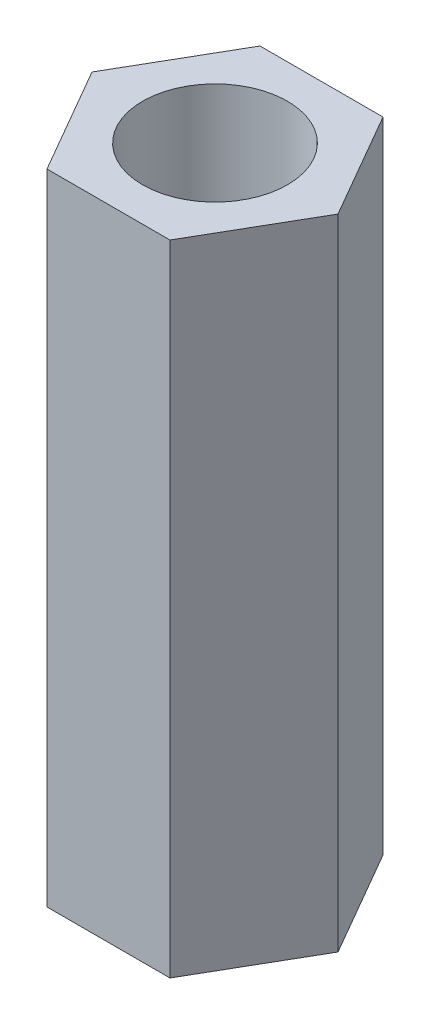
ISO-10303-21;
HEADER;
FILE_DESCRIPTION(('STEP AP214'),'2;1');
FILE_NAME('part.step','',(''),(''),'','','');
FILE_SCHEMA(('AUTOMOTIVE_DESIGN { 1 0 10303 214 1 1 1 1 }'));
ENDSEC;
DATA;
#1=APPLICATION_CONTEXT('core data for automotive mechanical design processes');
#2=APPLICATION_PROTOCOL_DEFINITION('international standard','automotive_design',2000,#1);
#3=PRODUCT_CONTEXT('',#1,'mechanical');
#4=PRODUCT('Part','Part','',(#3));
#5=PRODUCT_RELATED_PRODUCT_CATEGORY('part','',(#4));
#6=PRODUCT_DEFINITION_FORMATION('','',#4);
#7=PRODUCT_DEFINITION_CONTEXT('part definition',#1,'design');
#8=PRODUCT_DEFINITION('design','',#6,#7);
#9=PRODUCT_DEFINITION_SHAPE('','',#8);
#10=(LENGTH_UNIT() NAMED_UNIT(*) SI_UNIT(.MILLI.,.METRE.));
#11=(NAMED_UNIT(*) PLANE_ANGLE_UNIT() SI_UNIT($,.RADIAN.));
#12=(NAMED_UNIT(*) SI_UNIT($,.STERADIAN.) SOLID_ANGLE_UNIT());
#13=UNCERTAINTY_MEASURE_WITH_UNIT(LENGTH_MEASURE(1.E-05),#10,'distance_accuracy_value','');
#14=(GEOMETRIC_REPRESENTATION_CONTEXT(3) GLOBAL_UNCERTAINTY_ASSIGNED_CONTEXT((#13)) GLOBAL_UNIT_ASSIGNED_CONTEXT((#10,
#11,#12)) REPRESENTATION_CONTEXT('',''));
#15=CARTESIAN_POINT('',(0.,0.,0.));
#16=DIRECTION('',(0.,0.,1.));
#17=DIRECTION('',(1.,0.,0.));
#18=AXIS2_PLACEMENT_3D('',#15,#16,#17);
#19=CARTESIAN_POINT('',(0.,15.,0.));
#20=DIRECTION('',(0.,1.,0.));
#21=DIRECTION('',(0.,0.,1.));
#22=AXIS2_PLACEMENT_3D('',#19,#20,#21);
#23=PLANE('',#22);
#24=DIRECTION('',(0.5,0.,-0.866025403784439));
#25=VECTOR('',#24,1.);
#26=CARTESIAN_POINT('',(1.44337567297407,15.,2.5));
#27=LINE('',#26,#25);
#28=CARTESIAN_POINT('',(1.44337567297407,15.,2.5));
#29=VERTEX_POINT('',#28);
#30=CARTESIAN_POINT('',(2.88675134594813,15.,0.));
#31=VERTEX_POINT('',#30);
#32=EDGE_CURVE('E129',#29,#31,#27,.T.);
#33=ORIENTED_EDGE('',*,*,#32,.T.);
#34=DIRECTION('',(-0.5,0.,-0.866025403784438));
#35=VECTOR('',#34,1.);
#36=CARTESIAN_POINT('',(2.88675134594813,15.,0.));
#37=LINE('',#36,#35);
#38=CARTESIAN_POINT('',(1.44337567297406,15.,-2.5));
#39=VERTEX_POINT('',#38);
#40=EDGE_CURVE('E87',#31,#39,#37,.T.);
#41=ORIENTED_EDGE('',*,*,#40,.T.);
#42=DIRECTION('',(-1.,0.,0.));
#43=VECTOR('',#42,1.);
#44=CARTESIAN_POINT('',(1.44337567297406,15.,-2.5));
#45=LINE('',#44,#43);
#46=CARTESIAN_POINT('',(-1.44337567297406,15.,-2.5));
#47=VERTEX_POINT('',#46);
#48=EDGE_CURVE('E100',#39,#47,#45,.T.);
#49=ORIENTED_EDGE('',*,*,#48,.T.);
#50=DIRECTION('',(-0.5,0.,0.866025403784439));
#51=VECTOR('',#50,1.);
#52=CARTESIAN_POINT('',(-1.44337567297406,15.,-2.5));
#53=LINE('',#52,#51);
#54=CARTESIAN_POINT('',(-2.88675134594813,15.,0.));
#55=VERTEX_POINT('',#54);
#56=EDGE_CURVE('E94',#47,#55,#53,.T.);
#57=ORIENTED_EDGE('',*,*,#56,.T.);
#58=DIRECTION('',(0.5,0.,0.866025403784438));
#59=VECTOR('',#58,1.);
#60=CARTESIAN_POINT('',(-2.88675134594813,15.,0.));
#61=LINE('',#60,#59);
#62=CARTESIAN_POINT('',(-1.44337567297406,15.,2.5));
#63=VERTEX_POINT('',#62);
#64=EDGE_CURVE('E98',#55,#63,#61,.T.);
#65=ORIENTED_EDGE('',*,*,#64,.T.);
#66=DIRECTION('',(1.,0.,0.));
#67=VECTOR('',#66,1.);
#68=CARTESIAN_POINT('',(-1.44337567297406,15.,2.5));
#69=LINE('',#68,#67);
#70=EDGE_CURVE('E50',#63,#29,#69,.T.);
#71=ORIENTED_EDGE('',*,*,#70,.T.);
#72=EDGE_LOOP('',(#33,#41,#49,#57,#65,#71));
#73=FACE_BOUND('',#72,.T.);
#74=CARTESIAN_POINT('',(0.,15.,0.));
#75=DIRECTION('',(0.,1.,0.));
#76=DIRECTION('',(0.,0.,1.));
#77=AXIS2_PLACEMENT_3D('',#74,#75,#76);
#78=CIRCLE('',#77,1.7);
#79=CARTESIAN_POINT('',(0.,15.,1.7));
#80=VERTEX_POINT('',#79);
#81=EDGE_CURVE('E122',#80,#80,#78,.T.);
#82=ORIENTED_EDGE('',*,*,#81,.F.);
#83=EDGE_LOOP('',(#82));
#84=FACE_BOUND('',#83,.T.);
#85=ADVANCED_FACE('F33',(#73,#84),#23,.T.);
#86=CARTESIAN_POINT('',(0.,0.,0.));
#87=DIRECTION('',(0.,1.,0.));
#88=DIRECTION('',(0.,0.,1.));
#89=AXIS2_PLACEMENT_3D('',#86,#87,#88);
#90=PLANE('',#89);
#91=DIRECTION('',(0.5,0.,-0.866025403784439));
#92=VECTOR('',#91,1.);
#93=CARTESIAN_POINT('',(1.44337567297407,0.,2.5));
#94=LINE('',#93,#92);
#95=CARTESIAN_POINT('',(1.44337567297407,0.,2.5));
#96=VERTEX_POINT('',#95);
#97=CARTESIAN_POINT('',(2.88675134594813,0.,0.));
#98=VERTEX_POINT('',#97);
#99=EDGE_CURVE('E118',#96,#98,#94,.T.);
#100=ORIENTED_EDGE('',*,*,#99,.F.);
#101=DIRECTION('',(1.,0.,0.));
#102=VECTOR('',#101,1.);
#103=CARTESIAN_POINT('',(-1.44337567297406,0.,2.5));
#104=LINE('',#103,#102);
#105=CARTESIAN_POINT('',(-1.44337567297406,0.,2.5));
#106=VERTEX_POINT('',#105);
#107=EDGE_CURVE('E79',#106,#96,#104,.T.);
#108=ORIENTED_EDGE('',*,*,#107,.F.);
#109=DIRECTION('',(0.5,0.,0.866025403784438));
#110=VECTOR('',#109,1.);
#111=CARTESIAN_POINT('',(-2.88675134594813,0.,0.));
#112=LINE('',#111,#110);
#113=CARTESIAN_POINT('',(-2.88675134594813,0.,0.));
#114=VERTEX_POINT('',#113);
#115=EDGE_CURVE('E73',#114,#106,#112,.T.);
#116=ORIENTED_EDGE('',*,*,#115,.F.);
#117=DIRECTION('',(-0.5,0.,0.866025403784439));
#118=VECTOR('',#117,1.);
#119=CARTESIAN_POINT('',(-1.44337567297406,0.,-2.5));
#120=LINE('',#119,#118);
#121=CARTESIAN_POINT('',(-1.44337567297406,0.,-2.5));
#122=VERTEX_POINT('',#121);
#123=EDGE_CURVE('E108',#122,#114,#120,.T.);
#124=ORIENTED_EDGE('',*,*,#123,.F.);
#125=DIRECTION('',(-1.,0.,0.));
#126=VECTOR('',#125,1.);
#127=CARTESIAN_POINT('',(1.44337567297406,0.,-2.5));
#128=LINE('',#127,#126);
#129=CARTESIAN_POINT('',(1.44337567297406,0.,-2.5));
#130=VERTEX_POINT('',#129);
#131=EDGE_CURVE('E124',#130,#122,#128,.T.);
#132=ORIENTED_EDGE('',*,*,#131,.F.);
#133=DIRECTION('',(-0.5,0.,-0.866025403784438));
#134=VECTOR('',#133,1.);
#135=CARTESIAN_POINT('',(2.88675134594813,0.,0.));
#136=LINE('',#135,#134);
#137=EDGE_CURVE('E121',#98,#130,#136,.T.);
#138=ORIENTED_EDGE('',*,*,#137,.F.);
#139=EDGE_LOOP('',(#100,#108,#116,#124,#132,#138));
#140=FACE_BOUND('',#139,.T.);
#141=CARTESIAN_POINT('',(0.,0.,0.));
#142=DIRECTION('',(0.,1.,0.));
#143=DIRECTION('',(0.,0.,1.));
#144=AXIS2_PLACEMENT_3D('',#141,#142,#143);
#145=CIRCLE('',#144,1.7);
#146=CARTESIAN_POINT('',(0.,0.,1.7));
#147=VERTEX_POINT('',#146);
#148=EDGE_CURVE('E222',#147,#147,#145,.T.);
#149=ORIENTED_EDGE('',*,*,#148,.T.);
#150=EDGE_LOOP('',(#149));
#151=FACE_BOUND('',#150,.T.);
#152=ADVANCED_FACE('F138',(#140,#151),#90,.F.);
#153=CARTESIAN_POINT('',(1.44337567297407,15.,2.5));
#154=DIRECTION('',(-0.866025403784439,0.,-0.5));
#155=DIRECTION('',(-0.5,0.,0.866025403784439));
#156=AXIS2_PLACEMENT_3D('',#153,#154,#155);
#157=PLANE('',#156);
#158=ORIENTED_EDGE('',*,*,#99,.T.);
#159=DIRECTION('',(0.,-1.,0.));
#160=VECTOR('',#159,1.);
#161=CARTESIAN_POINT('',(2.88675134594813,15.,0.));
#162=LINE('',#161,#160);
#163=EDGE_CURVE('E11',#31,#98,#162,.T.);
#164=ORIENTED_EDGE('',*,*,#163,.F.);
#165=ORIENTED_EDGE('',*,*,#32,.F.);
#166=DIRECTION('',(0.,-1.,0.));
#167=VECTOR('',#166,1.);
#168=CARTESIAN_POINT('',(1.44337567297407,15.,2.5));
#169=LINE('',#168,#167);
#170=EDGE_CURVE('E114',#29,#96,#169,.T.);
#171=ORIENTED_EDGE('',*,*,#170,.T.);
#172=EDGE_LOOP('',(#158,#164,#165,#171));
#173=FACE_BOUND('',#172,.T.);
#174=ADVANCED_FACE('F35',(#173),#157,.F.);
#175=CARTESIAN_POINT('',(2.88675134594813,15.,0.));
#176=DIRECTION('',(-0.866025403784438,0.,0.5));
#177=DIRECTION('',(0.5,0.,0.866025403784439));
#178=AXIS2_PLACEMENT_3D('',#175,#176,#177);
#179=PLANE('',#178);
#180=ORIENTED_EDGE('',*,*,#137,.T.);
#181=DIRECTION('',(0.,-1.,0.));
#182=VECTOR('',#181,1.);
#183=CARTESIAN_POINT('',(1.44337567297406,15.,-2.5));
#184=LINE('',#183,#182);
#185=EDGE_CURVE('E42',#39,#130,#184,.T.);
#186=ORIENTED_EDGE('',*,*,#185,.F.);
#187=ORIENTED_EDGE('',*,*,#40,.F.);
#188=ORIENTED_EDGE('',*,*,#163,.T.);
#189=EDGE_LOOP('',(#180,#186,#187,#188));
#190=FACE_BOUND('',#189,.T.);
#191=ADVANCED_FACE('F163',(#190),#179,.F.);
#192=CARTESIAN_POINT('',(1.44337567297406,15.,-2.5));
#193=DIRECTION('',(0.,0.,1.));
#194=DIRECTION('',(1.,0.,0.));
#195=AXIS2_PLACEMENT_3D('',#192,#193,#194);
#196=PLANE('',#195);
#197=ORIENTED_EDGE('',*,*,#131,.T.);
#198=DIRECTION('',(0.,-1.,0.));
#199=VECTOR('',#198,1.);
#200=CARTESIAN_POINT('',(-1.44337567297406,15.,-2.5));
#201=LINE('',#200,#199);
#202=EDGE_CURVE('E109',#47,#122,#201,.T.);
#203=ORIENTED_EDGE('',*,*,#202,.F.);
#204=ORIENTED_EDGE('',*,*,#48,.F.);
#205=ORIENTED_EDGE('',*,*,#185,.T.);
#206=EDGE_LOOP('',(#197,#203,#204,#205));
#207=FACE_BOUND('',#206,.T.);
#208=ADVANCED_FACE('F135',(#207),#196,.F.);
#209=CARTESIAN_POINT('',(-1.44337567297406,15.,-2.5));
#210=DIRECTION('',(0.866025403784439,0.,0.5));
#211=DIRECTION('',(0.5,0.,-0.866025403784439));
#212=AXIS2_PLACEMENT_3D('',#209,#210,#211);
#213=PLANE('',#212);
#214=ORIENTED_EDGE('',*,*,#123,.T.);
#215=DIRECTION('',(0.,-1.,0.));
#216=VECTOR('',#215,1.);
#217=CARTESIAN_POINT('',(-2.88675134594813,15.,0.));
#218=LINE('',#217,#216);
#219=EDGE_CURVE('E105',#55,#114,#218,.T.);
#220=ORIENTED_EDGE('',*,*,#219,.F.);
#221=ORIENTED_EDGE('',*,*,#56,.F.);
#222=ORIENTED_EDGE('',*,*,#202,.T.);
#223=EDGE_LOOP('',(#214,#220,#221,#222));
#224=FACE_BOUND('',#223,.T.);
#225=ADVANCED_FACE('F106',(#224),#213,.F.);
#226=CARTESIAN_POINT('',(-2.88675134594813,15.,0.));
#227=DIRECTION('',(0.866025403784438,0.,-0.5));
#228=DIRECTION('',(-0.5,0.,-0.866025403784439));
#229=AXIS2_PLACEMENT_3D('',#226,#227,#228);
#230=PLANE('',#229);
#231=ORIENTED_EDGE('',*,*,#115,.T.);
#232=DIRECTION('',(0.,-1.,0.));
#233=VECTOR('',#232,1.);
#234=CARTESIAN_POINT('',(-1.44337567297406,15.,2.5));
#235=LINE('',#234,#233);
#236=EDGE_CURVE('E110',#63,#106,#235,.T.);
#237=ORIENTED_EDGE('',*,*,#236,.F.);
#238=ORIENTED_EDGE('',*,*,#64,.F.);
#239=ORIENTED_EDGE('',*,*,#219,.T.);
#240=EDGE_LOOP('',(#231,#237,#238,#239));
#241=FACE_BOUND('',#240,.T.);
#242=ADVANCED_FACE('F112',(#241),#230,.F.);
#243=CARTESIAN_POINT('',(-1.44337567297406,15.,2.5));
#244=DIRECTION('',(0.,0.,-1.));
#245=DIRECTION('',(-1.,0.,0.));
#246=AXIS2_PLACEMENT_3D('',#243,#244,#245);
#247=PLANE('',#246);
#248=ORIENTED_EDGE('',*,*,#107,.T.);
#249=ORIENTED_EDGE('',*,*,#170,.F.);
#250=ORIENTED_EDGE('',*,*,#70,.F.);
#251=ORIENTED_EDGE('',*,*,#236,.T.);
#252=EDGE_LOOP('',(#248,#249,#250,#251));
#253=FACE_BOUND('',#252,.T.);
#254=ADVANCED_FACE('F143',(#253),#247,.F.);
#255=CARTESIAN_POINT('',(0.,15.,0.));
#256=DIRECTION('',(0.,-1.,0.));
#257=DIRECTION('',(0.,0.,-1.));
#258=AXIS2_PLACEMENT_3D('',#255,#256,#257);
#259=CYLINDRICAL_SURFACE('',#258,1.7);
#260=ORIENTED_EDGE('',*,*,#81,.T.);
#261=EDGE_LOOP('',(#260));
#262=FACE_BOUND('',#261,.T.);
#263=ORIENTED_EDGE('',*,*,#148,.F.);
#264=EDGE_LOOP('',(#263));
#265=FACE_BOUND('',#264,.T.);
#266=ADVANCED_FACE('F145',(#262,#265),#259,.F.);
#267=CLOSED_SHELL('',(#85,#152,#174,#191,#208,#225,#242,#254,#266));
#268=MANIFOLD_SOLID_BREP('B2',#267);
#269=ADVANCED_BREP_SHAPE_REPRESENTATION('',(#18,#268),#14);
#270=SHAPE_DEFINITION_REPRESENTATION(#9,#269);
ENDSEC;
END-ISO-10303-21;
